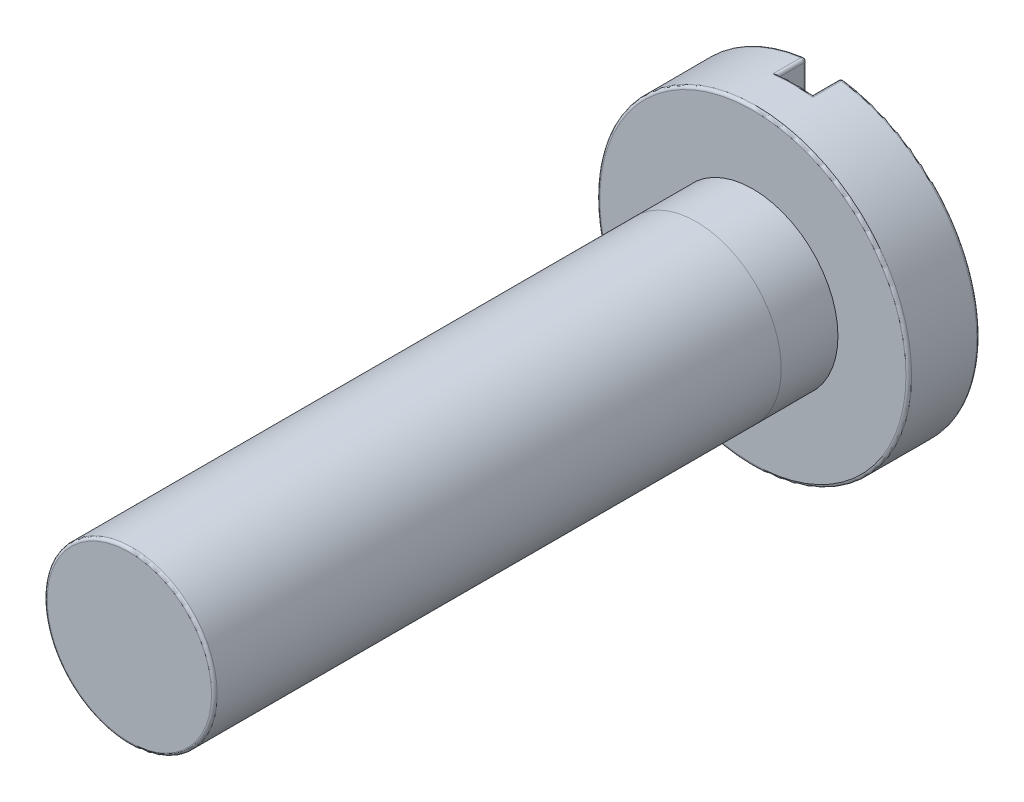
ISO-10303-21;
HEADER;
FILE_DESCRIPTION(('STEP AP214'),'2;1');
FILE_NAME('part.step','',(''),(''),'','','');
FILE_SCHEMA(('AUTOMOTIVE_DESIGN { 1 0 10303 214 1 1 1 1 }'));
ENDSEC;
DATA;
#1=APPLICATION_CONTEXT('core data for automotive mechanical design processes');
#2=APPLICATION_PROTOCOL_DEFINITION('international standard','automotive_design',2000,#1);
#3=PRODUCT_CONTEXT('',#1,'mechanical');
#4=PRODUCT('Part','Part','',(#3));
#5=PRODUCT_RELATED_PRODUCT_CATEGORY('part','',(#4));
#6=PRODUCT_DEFINITION_FORMATION('','',#4);
#7=PRODUCT_DEFINITION_CONTEXT('part definition',#1,'design');
#8=PRODUCT_DEFINITION('design','',#6,#7);
#9=PRODUCT_DEFINITION_SHAPE('','',#8);
#10=(LENGTH_UNIT() NAMED_UNIT(*) SI_UNIT(.MILLI.,.METRE.));
#11=(NAMED_UNIT(*) PLANE_ANGLE_UNIT() SI_UNIT($,.RADIAN.));
#12=(NAMED_UNIT(*) SI_UNIT($,.STERADIAN.) SOLID_ANGLE_UNIT());
#13=UNCERTAINTY_MEASURE_WITH_UNIT(LENGTH_MEASURE(1.E-05),#10,'distance_accuracy_value','');
#14=(GEOMETRIC_REPRESENTATION_CONTEXT(3) GLOBAL_UNCERTAINTY_ASSIGNED_CONTEXT((#13)) GLOBAL_UNIT_ASSIGNED_CONTEXT((#10,
#11,#12)) REPRESENTATION_CONTEXT('',''));
#15=CARTESIAN_POINT('',(0.,0.,0.));
#16=DIRECTION('',(0.,0.,1.));
#17=DIRECTION('',(1.,0.,0.));
#18=AXIS2_PLACEMENT_3D('',#15,#16,#17);
#19=CARTESIAN_POINT('',(0.,0.,11.));
#20=DIRECTION('',(0.,0.,-1.));
#21=DIRECTION('',(-1.,0.,0.));
#22=AXIS2_PLACEMENT_3D('',#19,#20,#21);
#23=CYLINDRICAL_SURFACE('',#22,1.5);
#24=CARTESIAN_POINT('',(0.,0.,10.95));
#25=DIRECTION('',(0.,0.,1.));
#26=DIRECTION('',(1.,0.,0.));
#27=AXIS2_PLACEMENT_3D('',#24,#25,#26);
#28=CIRCLE('',#27,1.5);
#29=CARTESIAN_POINT('',(1.5,0.,10.95));
#30=VERTEX_POINT('',#29);
#31=EDGE_CURVE('E175',#30,#30,#28,.F.);
#32=ORIENTED_EDGE('',*,*,#31,.T.);
#33=EDGE_LOOP('',(#32));
#34=FACE_BOUND('',#33,.T.);
#35=CARTESIAN_POINT('',(0.,0.,0.999999999999999));
#36=DIRECTION('',(0.,0.,-1.));
#37=DIRECTION('',(-1.,0.,0.));
#38=AXIS2_PLACEMENT_3D('',#35,#36,#37);
#39=CIRCLE('',#38,1.5);
#40=CARTESIAN_POINT('',(-1.5,0.,0.999999999999999));
#41=VERTEX_POINT('',#40);
#42=EDGE_CURVE('E11',#41,#41,#39,.T.);
#43=ORIENTED_EDGE('',*,*,#42,.F.);
#44=EDGE_LOOP('',(#43));
#45=FACE_BOUND('',#44,.T.);
#46=ADVANCED_FACE('F45',(#34,#45),#23,.T.);
#47=CARTESIAN_POINT('',(0.,0.,-1.25));
#48=DIRECTION('',(0.,0.,1.));
#49=DIRECTION('',(1.,0.,0.));
#50=AXIS2_PLACEMENT_3D('',#47,#48,#49);
#51=PLANE('',#50);
#52=DIRECTION('',(0.,-1.,0.));
#53=VECTOR('',#52,1.);
#54=CARTESIAN_POINT('',(-0.35,0.,-1.25));
#55=LINE('',#54,#53);
#56=CARTESIAN_POINT('',(-0.35,2.67721870604551,-1.25));
#57=VERTEX_POINT('',#56);
#58=CARTESIAN_POINT('',(-0.35,-2.67721870604551,-1.25));
#59=VERTEX_POINT('',#58);
#60=EDGE_CURVE('E212',#57,#59,#55,.T.);
#61=ORIENTED_EDGE('',*,*,#60,.T.);
#62=CARTESIAN_POINT('',(0.,0.,-1.25));
#63=DIRECTION('',(0.,0.,1.));
#64=DIRECTION('',(1.,0.,0.));
#65=AXIS2_PLACEMENT_3D('',#62,#63,#64);
#66=CIRCLE('',#65,2.7);
#67=EDGE_CURVE('E214',#59,#57,#66,.F.);
#68=ORIENTED_EDGE('',*,*,#67,.T.);
#69=EDGE_LOOP('',(#61,#68));
#70=FACE_BOUND('',#69,.T.);
#71=ADVANCED_FACE('F311',(#70),#51,.F.);
#72=ORIENTED_EDGE('',*,*,#42,.T.);
#73=EDGE_LOOP('',(#72));
#74=FACE_BOUND('',#73,.T.);
#75=CARTESIAN_POINT('',(0.,0.,0.));
#76=DIRECTION('',(0.,0.,1.));
#77=DIRECTION('',(1.,0.,0.));
#78=AXIS2_PLACEMENT_3D('',#75,#76,#77);
#79=CIRCLE('',#78,1.5);
#80=CARTESIAN_POINT('',(1.5,0.,0.));
#81=VERTEX_POINT('',#80);
#82=EDGE_CURVE('E337',#81,#81,#79,.T.);
#83=ORIENTED_EDGE('',*,*,#82,.T.);
#84=EDGE_LOOP('',(#83));
#85=FACE_BOUND('',#84,.T.);
#86=ADVANCED_FACE('F314',(#74,#85),#23,.T.);
#87=CARTESIAN_POINT('',(0.,0.,11.));
#88=DIRECTION('',(0.,0.,1.));
#89=DIRECTION('',(1.,0.,0.));
#90=AXIS2_PLACEMENT_3D('',#87,#88,#89);
#91=PLANE('',#90);
#92=CARTESIAN_POINT('',(0.,0.,11.));
#93=DIRECTION('',(0.,0.,1.));
#94=DIRECTION('',(1.,0.,0.));
#95=AXIS2_PLACEMENT_3D('',#92,#93,#94);
#96=CIRCLE('',#95,1.45);
#97=CARTESIAN_POINT('',(1.45,0.,11.));
#98=VERTEX_POINT('',#97);
#99=EDGE_CURVE('E339',#98,#98,#96,.T.);
#100=ORIENTED_EDGE('',*,*,#99,.T.);
#101=EDGE_LOOP('',(#100));
#102=FACE_BOUND('',#101,.T.);
#103=ADVANCED_FACE('F326',(#102),#91,.T.);
#104=CARTESIAN_POINT('',(0.,0.,-1.25));
#105=DIRECTION('',(0.,0.,1.));
#106=DIRECTION('',(1.,0.,0.));
#107=AXIS2_PLACEMENT_3D('',#104,#105,#106);
#108=CYLINDRICAL_SURFACE('',#107,2.75);
#109=CARTESIAN_POINT('',(0.,0.,-0.0499999999999999));
#110=DIRECTION('',(0.,0.,1.));
#111=DIRECTION('',(1.,0.,0.));
#112=AXIS2_PLACEMENT_3D('',#109,#110,#111);
#113=CIRCLE('',#112,2.75);
#114=CARTESIAN_POINT('',(2.75,0.,-0.0499999999999999));
#115=VERTEX_POINT('',#114);
#116=EDGE_CURVE('E189',#115,#115,#113,.F.);
#117=ORIENTED_EDGE('',*,*,#116,.T.);
#118=EDGE_LOOP('',(#117));
#119=FACE_BOUND('',#118,.T.);
#120=DIRECTION('',(0.,0.,1.));
#121=VECTOR('',#120,1.);
#122=CARTESIAN_POINT('',(0.356481481481481,-2.72679683023154,-1.25));
#123=LINE('',#122,#121);
#124=CARTESIAN_POINT('',(0.356481481481481,-2.72679683023154,-0.7));
#125=VERTEX_POINT('',#124);
#126=CARTESIAN_POINT('',(0.356481481481481,-2.72679683023154,-1.2));
#127=VERTEX_POINT('',#126);
#128=EDGE_CURVE('E185',#125,#127,#123,.F.);
#129=ORIENTED_EDGE('',*,*,#128,.T.);
#130=CARTESIAN_POINT('',(0.,0.,-1.2));
#131=DIRECTION('',(0.,0.,1.));
#132=DIRECTION('',(1.,0.,0.));
#133=AXIS2_PLACEMENT_3D('',#130,#131,#132);
#134=CIRCLE('',#133,2.75);
#135=CARTESIAN_POINT('',(0.356481481481482,2.72679683023154,-1.2));
#136=VERTEX_POINT('',#135);
#137=EDGE_CURVE('E187',#127,#136,#134,.T.);
#138=ORIENTED_EDGE('',*,*,#137,.T.);
#139=DIRECTION('',(0.,0.,1.));
#140=VECTOR('',#139,1.);
#141=CARTESIAN_POINT('',(0.356481481481482,2.72679683023154,-1.25));
#142=LINE('',#141,#140);
#143=CARTESIAN_POINT('',(0.356481481481482,2.72679683023154,-0.7));
#144=VERTEX_POINT('',#143);
#145=EDGE_CURVE('E183',#136,#144,#142,.T.);
#146=ORIENTED_EDGE('',*,*,#145,.T.);
#147=CARTESIAN_POINT('',(0.,0.,-0.7));
#148=DIRECTION('',(0.,0.,-1.));
#149=DIRECTION('',(-1.,0.,0.));
#150=AXIS2_PLACEMENT_3D('',#147,#148,#149);
#151=CIRCLE('',#150,2.75);
#152=CARTESIAN_POINT('',(-0.356481481481481,2.72679683023154,-0.7));
#153=VERTEX_POINT('',#152);
#154=EDGE_CURVE('E141',#144,#153,#151,.F.);
#155=ORIENTED_EDGE('',*,*,#154,.T.);
#156=DIRECTION('',(0.,0.,1.));
#157=VECTOR('',#156,1.);
#158=CARTESIAN_POINT('',(-0.356481481481481,2.72679683023154,-1.25));
#159=LINE('',#158,#157);
#160=CARTESIAN_POINT('',(-0.356481481481481,2.72679683023154,-1.2));
#161=VERTEX_POINT('',#160);
#162=EDGE_CURVE('E133',#153,#161,#159,.F.);
#163=ORIENTED_EDGE('',*,*,#162,.T.);
#164=CARTESIAN_POINT('',(0.,0.,-1.2));
#165=DIRECTION('',(0.,0.,1.));
#166=DIRECTION('',(1.,0.,0.));
#167=AXIS2_PLACEMENT_3D('',#164,#165,#166);
#168=CIRCLE('',#167,2.75);
#169=CARTESIAN_POINT('',(-0.356481481481482,-2.72679683023154,-1.2));
#170=VERTEX_POINT('',#169);
#171=EDGE_CURVE('E138',#161,#170,#168,.T.);
#172=ORIENTED_EDGE('',*,*,#171,.T.);
#173=DIRECTION('',(0.,0.,1.));
#174=VECTOR('',#173,1.);
#175=CARTESIAN_POINT('',(-0.356481481481482,-2.72679683023154,-1.25));
#176=LINE('',#175,#174);
#177=CARTESIAN_POINT('',(-0.356481481481482,-2.72679683023154,-0.7));
#178=VERTEX_POINT('',#177);
#179=EDGE_CURVE('E144',#170,#178,#176,.T.);
#180=ORIENTED_EDGE('',*,*,#179,.T.);
#181=CARTESIAN_POINT('',(0.,0.,-0.7));
#182=DIRECTION('',(0.,0.,-1.));
#183=DIRECTION('',(-1.,0.,0.));
#184=AXIS2_PLACEMENT_3D('',#181,#182,#183);
#185=CIRCLE('',#184,2.75);
#186=EDGE_CURVE('E181',#178,#125,#185,.F.);
#187=ORIENTED_EDGE('',*,*,#186,.T.);
#188=EDGE_LOOP('',(#129,#138,#146,#155,#163,#172,#180,#187));
#189=FACE_BOUND('',#188,.T.);
#190=ADVANCED_FACE('F135',(#119,#189),#108,.T.);
#191=CARTESIAN_POINT('',(0.,0.,-1.25));
#192=DIRECTION('',(0.,0.,1.));
#193=DIRECTION('',(1.,0.,0.));
#194=AXIS2_PLACEMENT_3D('',#191,#192,#193);
#195=CIRCLE('',#194,2.7);
#196=CARTESIAN_POINT('',(0.35,2.67721870604551,-1.25));
#197=VERTEX_POINT('',#196);
#198=CARTESIAN_POINT('',(0.35,-2.67721870604551,-1.25));
#199=VERTEX_POINT('',#198);
#200=EDGE_CURVE('E207',#197,#199,#195,.F.);
#201=ORIENTED_EDGE('',*,*,#200,.T.);
#202=DIRECTION('',(0.,1.,0.));
#203=VECTOR('',#202,1.);
#204=CARTESIAN_POINT('',(0.35,0.,-1.25));
#205=LINE('',#204,#203);
#206=EDGE_CURVE('E209',#199,#197,#205,.T.);
#207=ORIENTED_EDGE('',*,*,#206,.T.);
#208=EDGE_LOOP('',(#201,#207));
#209=FACE_BOUND('',#208,.T.);
#210=ADVANCED_FACE('F320',(#209),#51,.F.);
#211=CARTESIAN_POINT('',(0.,0.,0.));
#212=DIRECTION('',(0.,0.,1.));
#213=DIRECTION('',(1.,0.,0.));
#214=AXIS2_PLACEMENT_3D('',#211,#212,#213);
#215=PLANE('',#214);
#216=CARTESIAN_POINT('',(0.,0.,0.));
#217=DIRECTION('',(0.,0.,1.));
#218=DIRECTION('',(1.,0.,0.));
#219=AXIS2_PLACEMENT_3D('',#216,#217,#218);
#220=CIRCLE('',#219,2.7);
#221=CARTESIAN_POINT('',(2.7,0.,0.));
#222=VERTEX_POINT('',#221);
#223=EDGE_CURVE('E172',#222,#222,#220,.T.);
#224=ORIENTED_EDGE('',*,*,#223,.T.);
#225=EDGE_LOOP('',(#224));
#226=FACE_BOUND('',#225,.T.);
#227=ORIENTED_EDGE('',*,*,#82,.F.);
#228=EDGE_LOOP('',(#227));
#229=FACE_BOUND('',#228,.T.);
#230=ADVANCED_FACE('F370',(#226,#229),#215,.T.);
#231=CARTESIAN_POINT('',(-0.299999999999999,4.18375597630475,-0.75));
#232=DIRECTION('',(-1.,0.,0.));
#233=DIRECTION('',(0.,-1.,0.));
#234=AXIS2_PLACEMENT_3D('',#231,#232,#233);
#235=PLANE('',#234);
#236=DIRECTION('',(0.,1.,0.));
#237=VECTOR('',#236,1.);
#238=CARTESIAN_POINT('',(-0.299999999999999,4.18375597630475,-0.75));
#239=LINE('',#238,#237);
#240=CARTESIAN_POINT('',(-0.3,-2.67721870604551,-0.75));
#241=VERTEX_POINT('',#240);
#242=CARTESIAN_POINT('',(-0.3,2.67721870604551,-0.75));
#243=VERTEX_POINT('',#242);
#244=EDGE_CURVE('E345',#241,#243,#239,.T.);
#245=ORIENTED_EDGE('',*,*,#244,.F.);
#246=DIRECTION('',(0.,0.,-1.));
#247=VECTOR('',#246,1.);
#248=CARTESIAN_POINT('',(-0.3,-2.67721870604551,-1.25));
#249=LINE('',#248,#247);
#250=CARTESIAN_POINT('',(-0.3,-2.67721870604551,-1.2));
#251=VERTEX_POINT('',#250);
#252=EDGE_CURVE('E195',#241,#251,#249,.T.);
#253=ORIENTED_EDGE('',*,*,#252,.T.);
#254=DIRECTION('',(0.,-1.,0.));
#255=VECTOR('',#254,1.);
#256=CARTESIAN_POINT('',(-0.299999999999999,4.18375597630475,-1.2));
#257=LINE('',#256,#255);
#258=CARTESIAN_POINT('',(-0.3,2.67721870604551,-1.2));
#259=VERTEX_POINT('',#258);
#260=EDGE_CURVE('E192',#251,#259,#257,.F.);
#261=ORIENTED_EDGE('',*,*,#260,.T.);
#262=DIRECTION('',(0.,0.,-1.));
#263=VECTOR('',#262,1.);
#264=CARTESIAN_POINT('',(-0.3,2.67721870604551,-0.75));
#265=LINE('',#264,#263);
#266=EDGE_CURVE('E152',#259,#243,#265,.F.);
#267=ORIENTED_EDGE('',*,*,#266,.T.);
#268=EDGE_LOOP('',(#245,#253,#261,#267));
#269=FACE_BOUND('',#268,.T.);
#270=ADVANCED_FACE('F365',(#269),#235,.F.);
#271=CARTESIAN_POINT('',(0.3,4.18375597630475,-0.75));
#272=DIRECTION('',(1.,0.,0.));
#273=DIRECTION('',(0.,1.,0.));
#274=AXIS2_PLACEMENT_3D('',#271,#272,#273);
#275=PLANE('',#274);
#276=DIRECTION('',(0.,1.,0.));
#277=VECTOR('',#276,1.);
#278=CARTESIAN_POINT('',(0.3,4.18375597630475,-1.2));
#279=LINE('',#278,#277);
#280=CARTESIAN_POINT('',(0.3,2.67721870604551,-1.2));
#281=VERTEX_POINT('',#280);
#282=CARTESIAN_POINT('',(0.3,-2.67721870604551,-1.2));
#283=VERTEX_POINT('',#282);
#284=EDGE_CURVE('E201',#281,#283,#279,.F.);
#285=ORIENTED_EDGE('',*,*,#284,.T.);
#286=DIRECTION('',(0.,0.,-1.));
#287=VECTOR('',#286,1.);
#288=CARTESIAN_POINT('',(0.3,-2.67721870604551,-0.75));
#289=LINE('',#288,#287);
#290=CARTESIAN_POINT('',(0.3,-2.67721870604551,-0.75));
#291=VERTEX_POINT('',#290);
#292=EDGE_CURVE('E205',#283,#291,#289,.F.);
#293=ORIENTED_EDGE('',*,*,#292,.T.);
#294=DIRECTION('',(0.,-1.,0.));
#295=VECTOR('',#294,1.);
#296=CARTESIAN_POINT('',(0.3,4.18375597630475,-0.75));
#297=LINE('',#296,#295);
#298=CARTESIAN_POINT('',(0.3,2.67721870604551,-0.75));
#299=VERTEX_POINT('',#298);
#300=EDGE_CURVE('E340',#299,#291,#297,.T.);
#301=ORIENTED_EDGE('',*,*,#300,.F.);
#302=DIRECTION('',(0.,0.,-1.));
#303=VECTOR('',#302,1.);
#304=CARTESIAN_POINT('',(0.3,2.67721870604551,-1.25));
#305=LINE('',#304,#303);
#306=EDGE_CURVE('E203',#299,#281,#305,.T.);
#307=ORIENTED_EDGE('',*,*,#306,.T.);
#308=EDGE_LOOP('',(#285,#293,#301,#307));
#309=FACE_BOUND('',#308,.T.);
#310=ADVANCED_FACE('F360',(#309),#275,.F.);
#311=CARTESIAN_POINT('',(0.,0.,-0.75));
#312=DIRECTION('',(0.,0.,-1.));
#313=DIRECTION('',(-1.,0.,0.));
#314=AXIS2_PLACEMENT_3D('',#311,#312,#313);
#315=PLANE('',#314);
#316=ORIENTED_EDGE('',*,*,#300,.T.);
#317=CARTESIAN_POINT('',(0.35,-2.67721870604551,-0.75));
#318=DIRECTION('',(0.,0.,-1.));
#319=DIRECTION('',(-1.,0.,0.));
#320=AXIS2_PLACEMENT_3D('',#317,#318,#319);
#321=CIRCLE('',#320,0.05);
#322=CARTESIAN_POINT('',(0.300363987404623,-2.68324085297433,-0.75));
#323=VERTEX_POINT('',#322);
#324=EDGE_CURVE('E218',#291,#323,#321,.F.);
#325=ORIENTED_EDGE('',*,*,#324,.T.);
#326=CARTESIAN_POINT('',(0.,0.,-0.75));
#327=DIRECTION('',(0.,0.,-1.));
#328=DIRECTION('',(-1.,0.,0.));
#329=AXIS2_PLACEMENT_3D('',#326,#327,#328);
#330=CIRCLE('',#329,2.7);
#331=CARTESIAN_POINT('',(-0.300363987404624,-2.68324085297433,-0.75));
#332=VERTEX_POINT('',#331);
#333=EDGE_CURVE('E199',#323,#332,#330,.T.);
#334=ORIENTED_EDGE('',*,*,#333,.T.);
#335=CARTESIAN_POINT('',(-0.35,-2.67721870604551,-0.75));
#336=DIRECTION('',(0.,0.,-1.));
#337=DIRECTION('',(-1.,0.,0.));
#338=AXIS2_PLACEMENT_3D('',#335,#336,#337);
#339=CIRCLE('',#338,0.05);
#340=EDGE_CURVE('E216',#332,#241,#339,.F.);
#341=ORIENTED_EDGE('',*,*,#340,.T.);
#342=ORIENTED_EDGE('',*,*,#244,.T.);
#343=CARTESIAN_POINT('',(-0.35,2.67721870604551,-0.75));
#344=DIRECTION('',(0.,0.,-1.));
#345=DIRECTION('',(-1.,0.,0.));
#346=AXIS2_PLACEMENT_3D('',#343,#344,#345);
#347=CIRCLE('',#346,0.05);
#348=CARTESIAN_POINT('',(-0.300363987404623,2.68324085297433,-0.75));
#349=VERTEX_POINT('',#348);
#350=EDGE_CURVE('E221',#243,#349,#347,.F.);
#351=ORIENTED_EDGE('',*,*,#350,.T.);
#352=CARTESIAN_POINT('',(0.,0.,-0.75));
#353=DIRECTION('',(0.,0.,-1.));
#354=DIRECTION('',(-1.,0.,0.));
#355=AXIS2_PLACEMENT_3D('',#352,#353,#354);
#356=CIRCLE('',#355,2.7);
#357=CARTESIAN_POINT('',(0.300363987404624,2.68324085297433,-0.75));
#358=VERTEX_POINT('',#357);
#359=EDGE_CURVE('E61',#349,#358,#356,.T.);
#360=ORIENTED_EDGE('',*,*,#359,.T.);
#361=CARTESIAN_POINT('',(0.35,2.67721870604551,-0.75));
#362=DIRECTION('',(0.,0.,-1.));
#363=DIRECTION('',(-1.,0.,0.));
#364=AXIS2_PLACEMENT_3D('',#361,#362,#363);
#365=CIRCLE('',#364,0.05);
#366=EDGE_CURVE('E54',#358,#299,#365,.F.);
#367=ORIENTED_EDGE('',*,*,#366,.T.);
#368=EDGE_LOOP('',(#316,#325,#334,#341,#342,#351,#360,#367));
#369=FACE_BOUND('',#368,.T.);
#370=ADVANCED_FACE('F353',(#369),#315,.T.);
#371=CARTESIAN_POINT('',(0.,0.,10.95));
#372=DIRECTION('',(0.,0.,1.));
#373=DIRECTION('',(1.,0.,0.));
#374=AXIS2_PLACEMENT_3D('',#371,#372,#373);
#375=TOROIDAL_SURFACE('',#374,1.45,0.05);
#376=ORIENTED_EDGE('',*,*,#31,.F.);
#377=EDGE_LOOP('',(#376));
#378=FACE_BOUND('',#377,.T.);
#379=ORIENTED_EDGE('',*,*,#99,.F.);
#380=EDGE_LOOP('',(#379));
#381=FACE_BOUND('',#380,.T.);
#382=ADVANCED_FACE('F350',(#378,#381),#375,.T.);
#383=CARTESIAN_POINT('',(0.,0.,-0.0499999999999999));
#384=DIRECTION('',(0.,0.,1.));
#385=DIRECTION('',(1.,0.,0.));
#386=AXIS2_PLACEMENT_3D('',#383,#384,#385);
#387=TOROIDAL_SURFACE('',#386,2.7,0.05);
#388=ORIENTED_EDGE('',*,*,#116,.F.);
#389=EDGE_LOOP('',(#388));
#390=FACE_BOUND('',#389,.T.);
#391=ORIENTED_EDGE('',*,*,#223,.F.);
#392=EDGE_LOOP('',(#391));
#393=FACE_BOUND('',#392,.T.);
#394=ADVANCED_FACE('F301',(#390,#393),#387,.T.);
#395=CARTESIAN_POINT('',(0.35,2.67721870604551,-1.25));
#396=DIRECTION('',(0.,0.,1.));
#397=DIRECTION('',(1.,0.,0.));
#398=AXIS2_PLACEMENT_3D('',#395,#396,#397);
#399=CYLINDRICAL_SURFACE('',#398,0.05);
#400=CARTESIAN_POINT('',(0.35,2.67721870604551,-1.2));
#401=DIRECTION('',(0.,0.,-1.));
#402=DIRECTION('',(-1.,0.,0.));
#403=AXIS2_PLACEMENT_3D('',#400,#401,#402);
#404=CIRCLE('',#403,0.05);
#405=EDGE_CURVE('E296',#281,#136,#404,.T.);
#406=ORIENTED_EDGE('',*,*,#405,.F.);
#407=ORIENTED_EDGE('',*,*,#306,.F.);
#408=ORIENTED_EDGE('',*,*,#366,.F.);
#409=CARTESIAN_POINT('',(0.300363987404624,2.68324085297433,-0.75));
#410=CARTESIAN_POINT('',(0.300631167166769,2.68547437331569,-0.750003729138399));
#411=CARTESIAN_POINT('',(0.301055569836781,2.68768292706106,-0.749848472822085));
#412=CARTESIAN_POINT('',(0.302175809681011,2.69197027976685,-0.749253948096206));
#413=CARTESIAN_POINT('',(0.302869252008545,2.69405004083571,-0.748817163621863));
#414=CARTESIAN_POINT('',(0.304488267778166,2.69803535506526,-0.747694083321286));
#415=CARTESIAN_POINT('',(0.305413182051087,2.69994138229566,-0.747008493570967));
#416=CARTESIAN_POINT('',(0.307450844125016,2.70356049857288,-0.745429928402364));
#417=CARTESIAN_POINT('',(0.308564016266847,2.70527313683666,-0.744536482720379));
#418=CARTESIAN_POINT('',(0.311418405655868,2.70914637426864,-0.742185197841091));
#419=CARTESIAN_POINT('',(0.313230670350072,2.71120501548178,-0.740645749147817));
#420=CARTESIAN_POINT('',(0.317045785422442,2.71491661715571,-0.737333204739563));
#421=CARTESIAN_POINT('',(0.319048991869287,2.71656879826998,-0.735559670034907));
#422=CARTESIAN_POINT('',(0.323958204302219,2.72004364781821,-0.73114718583865));
#423=CARTESIAN_POINT('',(0.326919192374302,2.72169460207119,-0.72843455814578));
#424=CARTESIAN_POINT('',(0.332952629957707,2.72433827602402,-0.722823185149971));
#425=CARTESIAN_POINT('',(0.336025196371425,2.72533028304509,-0.719924242042216));
#426=CARTESIAN_POINT('',(0.341844827104958,2.7266284061346,-0.714363874108607));
#427=CARTESIAN_POINT('',(0.344588493143613,2.72700051489173,-0.711713694134898));
#428=CARTESIAN_POINT('',(0.350055859083999,2.72729337961383,-0.706377148706255));
#429=CARTESIAN_POINT('',(0.352779587334378,2.72721500693138,-0.703690863128917));
#430=CARTESIAN_POINT('',(0.35581086150695,2.72688104309513,-0.700669704767802));
#431=CARTESIAN_POINT('',(0.356146413009055,2.72684062909513,-0.700334832439258));
#432=CARTESIAN_POINT('',(0.356481481481482,2.72679683023154,-0.7));
#433=B_SPLINE_CURVE_WITH_KNOTS('',3,(#409,#410,#411,#412,#413,#414,#415,#416,#417,#418,#419,
#420,#421,#422,#423,#424,#425,#426,#427,#428,#429,#430,#431,#432),.UNSPECIFIED.,.F.,.F.,(4,2,2,
2,2,2,2,2,2,2,2,4),(0.,0.006728379833121,0.0133981927551429,0.0200492237934416,
0.0267154513653282,0.0360989242322176,0.0455002511443426,0.0584560478220018,0.0714258340148829,
0.0828974422065299,0.0943468686908725,0.095774153785717),.UNSPECIFIED.);
#434=EDGE_CURVE('E291',#144,#358,#433,.F.);
#435=ORIENTED_EDGE('',*,*,#434,.F.);
#436=ORIENTED_EDGE('',*,*,#145,.F.);
#437=EDGE_LOOP('',(#406,#407,#408,#435,#436));
#438=FACE_BOUND('',#437,.T.);
#439=ADVANCED_FACE('F298',(#438),#399,.T.);
#440=CARTESIAN_POINT('',(0.35,2.67721870604551,-1.2));
#441=DIRECTION('',(0.,0.,-1.));
#442=DIRECTION('',(-1.,0.,0.));
#443=AXIS2_PLACEMENT_3D('',#440,#441,#442);
#444=SPHERICAL_SURFACE('',#443,0.05);
#445=CARTESIAN_POINT('',(0.35,2.67721870604551,-1.2));
#446=DIRECTION('',(0.,1.,0.));
#447=DIRECTION('',(0.,0.,1.));
#448=AXIS2_PLACEMENT_3D('',#445,#446,#447);
#449=CIRCLE('',#448,0.05);
#450=EDGE_CURVE('E278',#281,#197,#449,.F.);
#451=ORIENTED_EDGE('',*,*,#450,.F.);
#452=ORIENTED_EDGE('',*,*,#405,.T.);
#453=CARTESIAN_POINT('',(0.35,2.67721870604551,-1.2));
#454=DIRECTION('',(-0.99156248372056,0.12962962962963,0.));
#455=DIRECTION('',(-0.12962962962963,-0.99156248372056,0.));
#456=AXIS2_PLACEMENT_3D('',#453,#454,#455);
#457=CIRCLE('',#456,0.05);
#458=EDGE_CURVE('E297',#197,#136,#457,.F.);
#459=ORIENTED_EDGE('',*,*,#458,.F.);
#460=EDGE_LOOP('',(#451,#452,#459));
#461=FACE_BOUND('',#460,.T.);
#462=ADVANCED_FACE('F47',(#461),#444,.T.);
#463=CARTESIAN_POINT('',(0.,0.,-0.7));
#464=DIRECTION('',(0.,0.,-1.));
#465=DIRECTION('',(-1.,0.,0.));
#466=AXIS2_PLACEMENT_3D('',#463,#464,#465);
#467=TOROIDAL_SURFACE('',#466,2.7,0.05);
#468=ORIENTED_EDGE('',*,*,#359,.F.);
#469=CARTESIAN_POINT('',(-0.300363987404623,2.68324085297433,-0.75));
#470=CARTESIAN_POINT('',(-0.300631167166768,2.68547437331569,-0.750003729138399));
#471=CARTESIAN_POINT('',(-0.30105556983678,2.68768292706106,-0.749848472822085));
#472=CARTESIAN_POINT('',(-0.30217580968101,2.69197027976685,-0.749253948096206));
#473=CARTESIAN_POINT('',(-0.302869252008545,2.69405004083571,-0.748817163621863));
#474=CARTESIAN_POINT('',(-0.304488267778165,2.69803535506526,-0.747694083321286));
#475=CARTESIAN_POINT('',(-0.305413182051086,2.69994138229566,-0.747008493570967));
#476=CARTESIAN_POINT('',(-0.307450844125015,2.70356049857288,-0.745429928402364));
#477=CARTESIAN_POINT('',(-0.308564016266847,2.70527313683666,-0.744536482720379));
#478=CARTESIAN_POINT('',(-0.311418405655867,2.70914637426864,-0.742185197841092));
#479=CARTESIAN_POINT('',(-0.313230670350072,2.71120501548178,-0.740645749147818));
#480=CARTESIAN_POINT('',(-0.317045785422441,2.71491661715571,-0.737333204739563));
#481=CARTESIAN_POINT('',(-0.319048991869286,2.71656879826998,-0.735559670034907));
#482=CARTESIAN_POINT('',(-0.323958204302219,2.72004364781821,-0.73114718583865));
#483=CARTESIAN_POINT('',(-0.326919192374301,2.72169460207119,-0.728434558145781));
#484=CARTESIAN_POINT('',(-0.332952629957706,2.72433827602402,-0.722823185149971));
#485=CARTESIAN_POINT('',(-0.336025196371424,2.72533028304509,-0.719924242042216));
#486=CARTESIAN_POINT('',(-0.341844827104957,2.7266284061346,-0.714363874108608));
#487=CARTESIAN_POINT('',(-0.344588493143613,2.72700051489173,-0.711713694134899));
#488=CARTESIAN_POINT('',(-0.350055859083998,2.72729337961383,-0.706377148706254));
#489=CARTESIAN_POINT('',(-0.352779587334374,2.72721500693138,-0.703690863128914));
#490=CARTESIAN_POINT('',(-0.355810861506949,2.72688104309513,-0.700669704767801));
#491=CARTESIAN_POINT('',(-0.356146413009054,2.72684062909513,-0.700334832439257));
#492=CARTESIAN_POINT('',(-0.356481481481481,2.72679683023154,-0.7));
#493=B_SPLINE_CURVE_WITH_KNOTS('',3,(#469,#470,#471,#472,#473,#474,#475,#476,#477,#478,#479,
#480,#481,#482,#483,#484,#485,#486,#487,#488,#489,#490,#491,#492),.UNSPECIFIED.,.F.,.F.,(4,2,2,
2,2,2,2,2,2,2,2,4),(0.,0.006728379833121,0.0133981927551429,0.0200492237934416,
0.0267154513653281,0.0360989242322175,0.0455002511443425,0.0584560478220016,0.0714258340148824,
0.0828974422065297,0.0943468686908725,0.0957741537857171),.UNSPECIFIED.);
#494=EDGE_CURVE('E270',#153,#349,#493,.F.);
#495=ORIENTED_EDGE('',*,*,#494,.F.);
#496=ORIENTED_EDGE('',*,*,#154,.F.);
#497=ORIENTED_EDGE('',*,*,#434,.T.);
#498=EDGE_LOOP('',(#468,#495,#496,#497));
#499=FACE_BOUND('',#498,.T.);
#500=ADVANCED_FACE('F282',(#499),#467,.T.);
#501=CARTESIAN_POINT('',(0.,0.,-1.2));
#502=DIRECTION('',(0.,0.,1.));
#503=DIRECTION('',(1.,0.,0.));
#504=AXIS2_PLACEMENT_3D('',#501,#502,#503);
#505=TOROIDAL_SURFACE('',#504,2.7,0.05);
#506=ORIENTED_EDGE('',*,*,#458,.T.);
#507=ORIENTED_EDGE('',*,*,#137,.F.);
#508=CARTESIAN_POINT('',(0.35,-2.67721870604551,-1.2));
#509=DIRECTION('',(-0.99156248372056,-0.129629629629629,0.));
#510=DIRECTION('',(0.129629629629629,-0.99156248372056,0.));
#511=AXIS2_PLACEMENT_3D('',#508,#509,#510);
#512=CIRCLE('',#511,0.05);
#513=EDGE_CURVE('E267',#199,#127,#512,.T.);
#514=ORIENTED_EDGE('',*,*,#513,.F.);
#515=ORIENTED_EDGE('',*,*,#200,.F.);
#516=EDGE_LOOP('',(#506,#507,#514,#515));
#517=FACE_BOUND('',#516,.T.);
#518=ADVANCED_FACE('F286',(#517),#505,.T.);
#519=CARTESIAN_POINT('',(0.35,0.,-1.2));
#520=DIRECTION('',(0.,1.,0.));
#521=DIRECTION('',(-1.,0.,0.));
#522=AXIS2_PLACEMENT_3D('',#519,#520,#521);
#523=CYLINDRICAL_SURFACE('',#522,0.05);
#524=ORIENTED_EDGE('',*,*,#450,.T.);
#525=ORIENTED_EDGE('',*,*,#206,.F.);
#526=CARTESIAN_POINT('',(0.35,-2.67721870604551,-1.2));
#527=DIRECTION('',(0.,-1.,0.));
#528=DIRECTION('',(0.,0.,-1.));
#529=AXIS2_PLACEMENT_3D('',#526,#527,#528);
#530=CIRCLE('',#529,0.05);
#531=EDGE_CURVE('E156',#283,#199,#530,.T.);
#532=ORIENTED_EDGE('',*,*,#531,.F.);
#533=ORIENTED_EDGE('',*,*,#284,.F.);
#534=EDGE_LOOP('',(#524,#525,#532,#533));
#535=FACE_BOUND('',#534,.T.);
#536=ADVANCED_FACE('F287',(#535),#523,.T.);
#537=CARTESIAN_POINT('',(-0.35,2.67721870604551,-1.25));
#538=DIRECTION('',(0.,0.,1.));
#539=DIRECTION('',(1.,0.,0.));
#540=AXIS2_PLACEMENT_3D('',#537,#538,#539);
#541=CYLINDRICAL_SURFACE('',#540,0.05);
#542=ORIENTED_EDGE('',*,*,#350,.F.);
#543=ORIENTED_EDGE('',*,*,#266,.F.);
#544=CARTESIAN_POINT('',(-0.35,2.67721870604551,-1.2));
#545=DIRECTION('',(0.,0.,-1.));
#546=DIRECTION('',(-1.,0.,0.));
#547=AXIS2_PLACEMENT_3D('',#544,#545,#546);
#548=CIRCLE('',#547,0.05);
#549=EDGE_CURVE('E148',#161,#259,#548,.T.);
#550=ORIENTED_EDGE('',*,*,#549,.F.);
#551=ORIENTED_EDGE('',*,*,#162,.F.);
#552=ORIENTED_EDGE('',*,*,#494,.T.);
#553=EDGE_LOOP('',(#542,#543,#550,#551,#552));
#554=FACE_BOUND('',#553,.T.);
#555=ADVANCED_FACE('F151',(#554),#541,.T.);
#556=CARTESIAN_POINT('',(0.35,-2.67721870604551,-1.2));
#557=DIRECTION('',(0.,0.,-1.));
#558=DIRECTION('',(-1.,0.,0.));
#559=AXIS2_PLACEMENT_3D('',#556,#557,#558);
#560=SPHERICAL_SURFACE('',#559,0.05);
#561=ORIENTED_EDGE('',*,*,#531,.T.);
#562=ORIENTED_EDGE('',*,*,#513,.T.);
#563=CARTESIAN_POINT('',(0.35,-2.67721870604551,-1.2));
#564=DIRECTION('',(0.,0.,-1.));
#565=DIRECTION('',(-1.,0.,0.));
#566=AXIS2_PLACEMENT_3D('',#563,#564,#565);
#567=CIRCLE('',#566,0.05);
#568=EDGE_CURVE('E157',#283,#127,#567,.F.);
#569=ORIENTED_EDGE('',*,*,#568,.F.);
#570=EDGE_LOOP('',(#561,#562,#569));
#571=FACE_BOUND('',#570,.T.);
#572=ADVANCED_FACE('F439',(#571),#560,.T.);
#573=CARTESIAN_POINT('',(-0.35,2.67721870604551,-1.2));
#574=DIRECTION('',(0.,0.,-1.));
#575=DIRECTION('',(-1.,0.,0.));
#576=AXIS2_PLACEMENT_3D('',#573,#574,#575);
#577=SPHERICAL_SURFACE('',#576,0.05);
#578=CARTESIAN_POINT('',(-0.35,2.67721870604551,-1.2));
#579=DIRECTION('',(0.99156248372056,0.129629629629629,0.));
#580=DIRECTION('',(-0.129629629629629,0.99156248372056,0.));
#581=AXIS2_PLACEMENT_3D('',#578,#579,#580);
#582=CIRCLE('',#581,0.05);
#583=EDGE_CURVE('E160',#161,#57,#582,.F.);
#584=ORIENTED_EDGE('',*,*,#583,.F.);
#585=ORIENTED_EDGE('',*,*,#549,.T.);
#586=CARTESIAN_POINT('',(-0.35,2.67721870604551,-1.2));
#587=DIRECTION('',(0.,1.,0.));
#588=DIRECTION('',(0.,0.,1.));
#589=AXIS2_PLACEMENT_3D('',#586,#587,#588);
#590=CIRCLE('',#589,0.05);
#591=EDGE_CURVE('E162',#57,#259,#590,.F.);
#592=ORIENTED_EDGE('',*,*,#591,.F.);
#593=EDGE_LOOP('',(#584,#585,#592));
#594=FACE_BOUND('',#593,.T.);
#595=ADVANCED_FACE('F161',(#594),#577,.T.);
#596=CARTESIAN_POINT('',(0.35,-2.67721870604551,-1.25));
#597=DIRECTION('',(0.,0.,1.));
#598=DIRECTION('',(1.,0.,0.));
#599=AXIS2_PLACEMENT_3D('',#596,#597,#598);
#600=CYLINDRICAL_SURFACE('',#599,0.05);
#601=ORIENTED_EDGE('',*,*,#568,.T.);
#602=ORIENTED_EDGE('',*,*,#128,.F.);
#603=CARTESIAN_POINT('',(0.300363987404623,-2.68324085297433,-0.75));
#604=CARTESIAN_POINT('',(0.300631167166768,-2.68547437331569,-0.750003729138399));
#605=CARTESIAN_POINT('',(0.30105556983678,-2.68768292706106,-0.749848472822085));
#606=CARTESIAN_POINT('',(0.30217580968101,-2.69197027976685,-0.749253948096206));
#607=CARTESIAN_POINT('',(0.302869252008545,-2.69405004083571,-0.748817163621863));
#608=CARTESIAN_POINT('',(0.304488267778165,-2.69803535506526,-0.747694083321286));
#609=CARTESIAN_POINT('',(0.305413182051086,-2.69994138229566,-0.747008493570967));
#610=CARTESIAN_POINT('',(0.307450844125015,-2.70356049857288,-0.745429928402364));
#611=CARTESIAN_POINT('',(0.308564016266847,-2.70527313683666,-0.744536482720379));
#612=CARTESIAN_POINT('',(0.311418405655867,-2.70914637426864,-0.742185197841092));
#613=CARTESIAN_POINT('',(0.313230670350071,-2.71120501548178,-0.740645749147818));
#614=CARTESIAN_POINT('',(0.317045785422441,-2.71491661715571,-0.737333204739564));
#615=CARTESIAN_POINT('',(0.319048991869286,-2.71656879826998,-0.735559670034908));
#616=CARTESIAN_POINT('',(0.323958204302218,-2.72004364781821,-0.73114718583865));
#617=CARTESIAN_POINT('',(0.326919192374299,-2.72169460207119,-0.72843455814578));
#618=CARTESIAN_POINT('',(0.332952629957706,-2.72433827602402,-0.722823185149973));
#619=CARTESIAN_POINT('',(0.336025196371427,-2.72533028304509,-0.719924242042222));
#620=CARTESIAN_POINT('',(0.341844827104952,-2.7266284061346,-0.714363874108604));
#621=CARTESIAN_POINT('',(0.344588493143597,-2.72700051489173,-0.711713694134884));
#622=CARTESIAN_POINT('',(0.350055859084012,-2.72729337961383,-0.706377148706269));
#623=CARTESIAN_POINT('',(0.352779587334428,-2.72721500693138,-0.703690863128969));
#624=CARTESIAN_POINT('',(0.355810861506962,-2.72688104309513,-0.700669704767814));
#625=CARTESIAN_POINT('',(0.356146413009061,-2.72684062909513,-0.700334832439264));
#626=CARTESIAN_POINT('',(0.356481481481481,-2.72679683023154,-0.7));
#627=B_SPLINE_CURVE_WITH_KNOTS('',3,(#603,#604,#605,#606,#607,#608,#609,#610,#611,#612,#613,
#614,#615,#616,#617,#618,#619,#620,#621,#622,#623,#624,#625,#626),.UNSPECIFIED.,.F.,.F.,(4,2,2,
2,2,2,2,2,2,2,2,4),(0.,0.006728379833121,0.0133981927551429,0.0200492237934416,
0.0267154513653281,0.0360989242322173,0.0455002511443417,0.0584560478220004,0.071425834014881,
0.0828974422065292,0.0943468686908724,0.0957741537857171),.UNSPECIFIED.);
#628=EDGE_CURVE('E166',#323,#125,#627,.T.);
#629=ORIENTED_EDGE('',*,*,#628,.F.);
#630=ORIENTED_EDGE('',*,*,#324,.F.);
#631=ORIENTED_EDGE('',*,*,#292,.F.);
#632=EDGE_LOOP('',(#601,#602,#629,#630,#631));
#633=FACE_BOUND('',#632,.T.);
#634=ADVANCED_FACE('F247',(#633),#600,.T.);
#635=CARTESIAN_POINT('',(-0.35,0.,-1.2));
#636=DIRECTION('',(0.,-1.,0.));
#637=DIRECTION('',(1.,0.,0.));
#638=AXIS2_PLACEMENT_3D('',#635,#636,#637);
#639=CYLINDRICAL_SURFACE('',#638,0.05);
#640=ORIENTED_EDGE('',*,*,#591,.T.);
#641=ORIENTED_EDGE('',*,*,#260,.F.);
#642=CARTESIAN_POINT('',(-0.35,-2.67721870604551,-1.2));
#643=DIRECTION('',(0.,-1.,0.));
#644=DIRECTION('',(0.,0.,-1.));
#645=AXIS2_PLACEMENT_3D('',#642,#643,#644);
#646=CIRCLE('',#645,0.05);
#647=EDGE_CURVE('E260',#59,#251,#646,.T.);
#648=ORIENTED_EDGE('',*,*,#647,.F.);
#649=ORIENTED_EDGE('',*,*,#60,.F.);
#650=EDGE_LOOP('',(#640,#641,#648,#649));
#651=FACE_BOUND('',#650,.T.);
#652=ADVANCED_FACE('F251',(#651),#639,.T.);
#653=CARTESIAN_POINT('',(0.,0.,-1.2));
#654=DIRECTION('',(0.,0.,1.));
#655=DIRECTION('',(1.,0.,0.));
#656=AXIS2_PLACEMENT_3D('',#653,#654,#655);
#657=TOROIDAL_SURFACE('',#656,2.7,0.05);
#658=ORIENTED_EDGE('',*,*,#583,.T.);
#659=ORIENTED_EDGE('',*,*,#67,.F.);
#660=CARTESIAN_POINT('',(-0.35,-2.67721870604551,-1.2));
#661=DIRECTION('',(0.99156248372056,-0.12962962962963,0.));
#662=DIRECTION('',(0.12962962962963,0.99156248372056,0.));
#663=AXIS2_PLACEMENT_3D('',#660,#661,#662);
#664=CIRCLE('',#663,0.05);
#665=EDGE_CURVE('E170',#170,#59,#664,.T.);
#666=ORIENTED_EDGE('',*,*,#665,.F.);
#667=ORIENTED_EDGE('',*,*,#171,.F.);
#668=EDGE_LOOP('',(#658,#659,#666,#667));
#669=FACE_BOUND('',#668,.T.);
#670=ADVANCED_FACE('F168',(#669),#657,.T.);
#671=CARTESIAN_POINT('',(0.,0.,-0.7));
#672=DIRECTION('',(0.,0.,-1.));
#673=DIRECTION('',(-1.,0.,0.));
#674=AXIS2_PLACEMENT_3D('',#671,#672,#673);
#675=TOROIDAL_SURFACE('',#674,2.7,0.05);
#676=ORIENTED_EDGE('',*,*,#628,.T.);
#677=ORIENTED_EDGE('',*,*,#186,.F.);
#678=CARTESIAN_POINT('',(-0.300363987404624,-2.68324085297433,-0.75));
#679=CARTESIAN_POINT('',(-0.300631167166769,-2.68547437331569,-0.750003729138399));
#680=CARTESIAN_POINT('',(-0.301055569836781,-2.68768292706106,-0.749848472822085));
#681=CARTESIAN_POINT('',(-0.302175809681011,-2.69197027976685,-0.749253948096206));
#682=CARTESIAN_POINT('',(-0.302869252008545,-2.69405004083571,-0.748817163621863));
#683=CARTESIAN_POINT('',(-0.304488267778166,-2.69803535506526,-0.747694083321286));
#684=CARTESIAN_POINT('',(-0.305413182051087,-2.69994138229566,-0.747008493570967));
#685=CARTESIAN_POINT('',(-0.307450844125016,-2.70356049857288,-0.745429928402364));
#686=CARTESIAN_POINT('',(-0.308564016266847,-2.70527313683666,-0.744536482720379));
#687=CARTESIAN_POINT('',(-0.311418405655868,-2.70914637426864,-0.742185197841091));
#688=CARTESIAN_POINT('',(-0.313230670350072,-2.71120501548178,-0.740645749147817));
#689=CARTESIAN_POINT('',(-0.317045785422442,-2.71491661715571,-0.737333204739563));
#690=CARTESIAN_POINT('',(-0.319048991869287,-2.71656879826998,-0.735559670034907));
#691=CARTESIAN_POINT('',(-0.323958204302219,-2.72004364781821,-0.73114718583865));
#692=CARTESIAN_POINT('',(-0.326919192374302,-2.72169460207119,-0.72843455814578));
#693=CARTESIAN_POINT('',(-0.332952629957707,-2.72433827602402,-0.722823185149971));
#694=CARTESIAN_POINT('',(-0.336025196371424,-2.72533028304509,-0.719924242042216));
#695=CARTESIAN_POINT('',(-0.341844827104958,-2.7266284061346,-0.714363874108608));
#696=CARTESIAN_POINT('',(-0.344588493143613,-2.72700051489173,-0.711713694134898));
#697=CARTESIAN_POINT('',(-0.350055859083998,-2.72729337961383,-0.706377148706253));
#698=CARTESIAN_POINT('',(-0.352779587334374,-2.72721500693138,-0.703690863128913));
#699=CARTESIAN_POINT('',(-0.355810861506949,-2.72688104309513,-0.700669704767801));
#700=CARTESIAN_POINT('',(-0.356146413009055,-2.72684062909513,-0.700334832439257));
#701=CARTESIAN_POINT('',(-0.356481481481482,-2.72679683023154,-0.7));
#702=B_SPLINE_CURVE_WITH_KNOTS('',3,(#678,#679,#680,#681,#682,#683,#684,#685,#686,#687,#688,
#689,#690,#691,#692,#693,#694,#695,#696,#697,#698,#699,#700,#701),.UNSPECIFIED.,.F.,.F.,(4,2,2,
2,2,2,2,2,2,2,2,4),(0.,0.006728379833121,0.0133981927551429,0.0200492237934416,
0.0267154513653282,0.0360989242322177,0.0455002511443426,0.0584560478220018,0.0714258340148828,
0.0828974422065298,0.0943468686908723,0.0957741537857169),.UNSPECIFIED.);
#703=EDGE_CURVE('E226',#332,#178,#702,.T.);
#704=ORIENTED_EDGE('',*,*,#703,.F.);
#705=ORIENTED_EDGE('',*,*,#333,.F.);
#706=EDGE_LOOP('',(#676,#677,#704,#705));
#707=FACE_BOUND('',#706,.T.);
#708=ADVANCED_FACE('F235',(#707),#675,.T.);
#709=CARTESIAN_POINT('',(-0.35,-2.67721870604551,-1.2));
#710=DIRECTION('',(0.,0.,-1.));
#711=DIRECTION('',(-1.,0.,0.));
#712=AXIS2_PLACEMENT_3D('',#709,#710,#711);
#713=SPHERICAL_SURFACE('',#712,0.05);
#714=ORIENTED_EDGE('',*,*,#665,.T.);
#715=ORIENTED_EDGE('',*,*,#647,.T.);
#716=CARTESIAN_POINT('',(-0.35,-2.67721870604551,-1.2));
#717=DIRECTION('',(0.,0.,-1.));
#718=DIRECTION('',(-1.,0.,0.));
#719=AXIS2_PLACEMENT_3D('',#716,#717,#718);
#720=CIRCLE('',#719,0.05);
#721=EDGE_CURVE('E224',#170,#251,#720,.F.);
#722=ORIENTED_EDGE('',*,*,#721,.F.);
#723=EDGE_LOOP('',(#714,#715,#722));
#724=FACE_BOUND('',#723,.T.);
#725=ADVANCED_FACE('F242',(#724),#713,.T.);
#726=CARTESIAN_POINT('',(-0.35,-2.67721870604551,-1.25));
#727=DIRECTION('',(0.,0.,1.));
#728=DIRECTION('',(1.,0.,0.));
#729=AXIS2_PLACEMENT_3D('',#726,#727,#728);
#730=CYLINDRICAL_SURFACE('',#729,0.05);
#731=ORIENTED_EDGE('',*,*,#703,.T.);
#732=ORIENTED_EDGE('',*,*,#179,.F.);
#733=ORIENTED_EDGE('',*,*,#721,.T.);
#734=ORIENTED_EDGE('',*,*,#252,.F.);
#735=ORIENTED_EDGE('',*,*,#340,.F.);
#736=EDGE_LOOP('',(#731,#732,#733,#734,#735));
#737=FACE_BOUND('',#736,.T.);
#738=ADVANCED_FACE('F238',(#737),#730,.T.);
#739=CLOSED_SHELL('',(#46,#71,#86,#103,#190,#210,#230,#270,#310,#370,#382,#394,#439,#462,#500,
#518,#536,#555,#572,#595,#634,#652,#670,#708,#725,#738));
#740=MANIFOLD_SOLID_BREP('B2',#739);
#741=ADVANCED_BREP_SHAPE_REPRESENTATION('',(#18,#740),#14);
#742=SHAPE_DEFINITION_REPRESENTATION(#9,#741);
ENDSEC;
END-ISO-10303-21;
